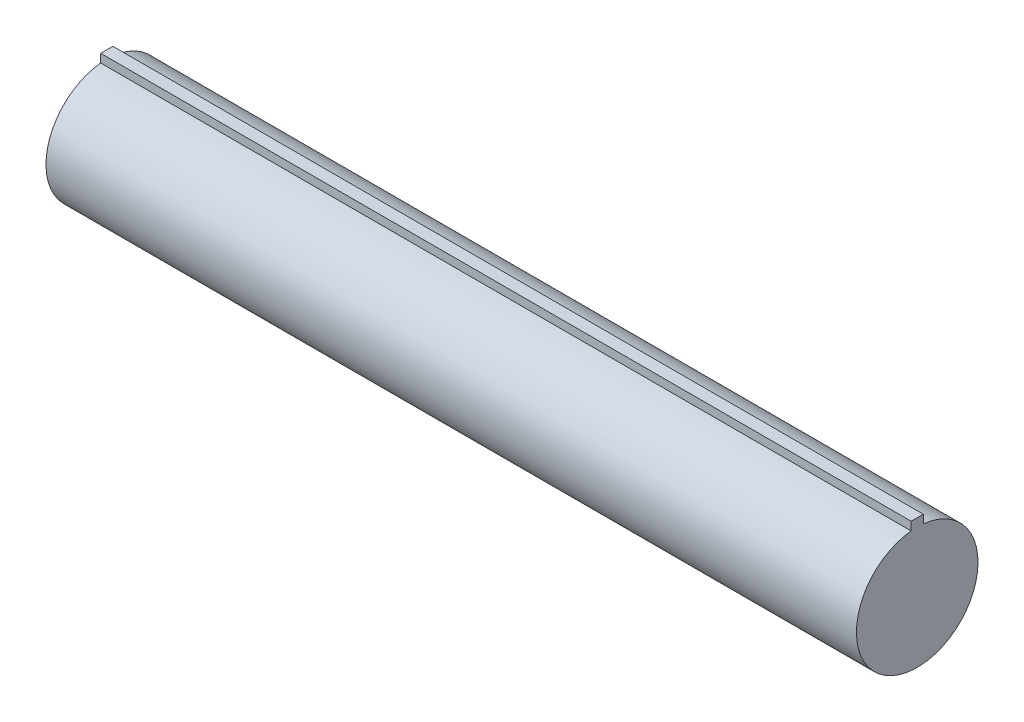
ISO-10303-21;
HEADER;
FILE_DESCRIPTION(('STEP AP214'),'2;1');
FILE_NAME('part.step','',(''),(''),'','','');
FILE_SCHEMA(('AUTOMOTIVE_DESIGN { 1 0 10303 214 1 1 1 1 }'));
ENDSEC;
DATA;
#1=APPLICATION_CONTEXT('core data for automotive mechanical design processes');
#2=APPLICATION_PROTOCOL_DEFINITION('international standard','automotive_design',2000,#1);
#3=PRODUCT_CONTEXT('',#1,'mechanical');
#4=PRODUCT('Part','Part','',(#3));
#5=PRODUCT_RELATED_PRODUCT_CATEGORY('part','',(#4));
#6=PRODUCT_DEFINITION_FORMATION('','',#4);
#7=PRODUCT_DEFINITION_CONTEXT('part definition',#1,'design');
#8=PRODUCT_DEFINITION('design','',#6,#7);
#9=PRODUCT_DEFINITION_SHAPE('','',#8);
#10=(LENGTH_UNIT() NAMED_UNIT(*) SI_UNIT(.MILLI.,.METRE.));
#11=(NAMED_UNIT(*) PLANE_ANGLE_UNIT() SI_UNIT($,.RADIAN.));
#12=(NAMED_UNIT(*) SI_UNIT($,.STERADIAN.) SOLID_ANGLE_UNIT());
#13=UNCERTAINTY_MEASURE_WITH_UNIT(LENGTH_MEASURE(1.E-05),#10,'distance_accuracy_value','');
#14=(GEOMETRIC_REPRESENTATION_CONTEXT(3) GLOBAL_UNCERTAINTY_ASSIGNED_CONTEXT((#13)) GLOBAL_UNIT_ASSIGNED_CONTEXT((#10,
#11,#12)) REPRESENTATION_CONTEXT('',''));
#15=CARTESIAN_POINT('',(0.,0.,0.));
#16=DIRECTION('',(0.,0.,1.));
#17=DIRECTION('',(1.,0.,0.));
#18=AXIS2_PLACEMENT_3D('',#15,#16,#17);
#19=CARTESIAN_POINT('',(100.,0.,0.));
#20=DIRECTION('',(-1.,0.,0.));
#21=DIRECTION('',(0.,0.,1.));
#22=AXIS2_PLACEMENT_3D('',#19,#20,#21);
#23=CYLINDRICAL_SURFACE('',#22,15.);
#24=CARTESIAN_POINT('',(-100.,0.,0.));
#25=DIRECTION('',(1.,0.,0.));
#26=DIRECTION('',(0.,0.,-1.));
#27=AXIS2_PLACEMENT_3D('',#24,#25,#26);
#28=CIRCLE('',#27,15.);
#29=CARTESIAN_POINT('',(-100.,14.9248115565993,1.5));
#30=VERTEX_POINT('',#29);
#31=CARTESIAN_POINT('',(-100.,14.9248115565993,-1.5));
#32=VERTEX_POINT('',#31);
#33=EDGE_CURVE('E104',#30,#32,#28,.T.);
#34=ORIENTED_EDGE('',*,*,#33,.T.);
#35=DIRECTION('',(-1.,0.,0.));
#36=VECTOR('',#35,1.);
#37=CARTESIAN_POINT('',(100.,14.9248115565993,-1.5));
#38=LINE('',#37,#36);
#39=CARTESIAN_POINT('',(100.,14.9248115565993,-1.5));
#40=VERTEX_POINT('',#39);
#41=EDGE_CURVE('E11',#40,#32,#38,.T.);
#42=ORIENTED_EDGE('',*,*,#41,.F.);
#43=CARTESIAN_POINT('',(100.,0.,0.));
#44=DIRECTION('',(1.,0.,0.));
#45=DIRECTION('',(0.,0.,-1.));
#46=AXIS2_PLACEMENT_3D('',#43,#44,#45);
#47=CIRCLE('',#46,15.);
#48=CARTESIAN_POINT('',(100.,14.9248115565993,1.5));
#49=VERTEX_POINT('',#48);
#50=EDGE_CURVE('E90',#49,#40,#47,.T.);
#51=ORIENTED_EDGE('',*,*,#50,.F.);
#52=DIRECTION('',(-1.,0.,0.));
#53=VECTOR('',#52,1.);
#54=CARTESIAN_POINT('',(100.,14.9248115565993,1.5));
#55=LINE('',#54,#53);
#56=EDGE_CURVE('E57',#49,#30,#55,.T.);
#57=ORIENTED_EDGE('',*,*,#56,.T.);
#58=EDGE_LOOP('',(#34,#42,#51,#57));
#59=FACE_BOUND('',#58,.T.);
#60=ADVANCED_FACE('F41',(#59),#23,.T.);
#61=CARTESIAN_POINT('',(100.,0.,-1.5));
#62=DIRECTION('',(0.,0.,1.));
#63=DIRECTION('',(0.,-1.,0.));
#64=AXIS2_PLACEMENT_3D('',#61,#62,#63);
#65=PLANE('',#64);
#66=DIRECTION('',(0.,1.,0.));
#67=VECTOR('',#66,1.);
#68=CARTESIAN_POINT('',(-100.,0.,-1.5));
#69=LINE('',#68,#67);
#70=CARTESIAN_POINT('',(-100.,17.,-1.5));
#71=VERTEX_POINT('',#70);
#72=EDGE_CURVE('E95',#32,#71,#69,.T.);
#73=ORIENTED_EDGE('',*,*,#72,.T.);
#74=DIRECTION('',(-1.,0.,0.));
#75=VECTOR('',#74,1.);
#76=CARTESIAN_POINT('',(100.,17.,-1.5));
#77=LINE('',#76,#75);
#78=CARTESIAN_POINT('',(100.,17.,-1.5));
#79=VERTEX_POINT('',#78);
#80=EDGE_CURVE('E49',#79,#71,#77,.T.);
#81=ORIENTED_EDGE('',*,*,#80,.F.);
#82=DIRECTION('',(0.,1.,0.));
#83=VECTOR('',#82,1.);
#84=CARTESIAN_POINT('',(100.,0.,-1.5));
#85=LINE('',#84,#83);
#86=EDGE_CURVE('E82',#40,#79,#85,.T.);
#87=ORIENTED_EDGE('',*,*,#86,.F.);
#88=ORIENTED_EDGE('',*,*,#41,.T.);
#89=EDGE_LOOP('',(#73,#81,#87,#88));
#90=FACE_BOUND('',#89,.T.);
#91=ADVANCED_FACE('F94',(#90),#65,.F.);
#92=CARTESIAN_POINT('',(100.,17.,0.));
#93=DIRECTION('',(0.,1.,0.));
#94=DIRECTION('',(0.,0.,1.));
#95=AXIS2_PLACEMENT_3D('',#92,#93,#94);
#96=PLANE('',#95);
#97=DIRECTION('',(0.,0.,-1.));
#98=VECTOR('',#97,1.);
#99=CARTESIAN_POINT('',(-100.,17.,0.));
#100=LINE('',#99,#98);
#101=CARTESIAN_POINT('',(-100.,17.,1.5));
#102=VERTEX_POINT('',#101);
#103=EDGE_CURVE('E107',#102,#71,#100,.T.);
#104=ORIENTED_EDGE('',*,*,#103,.F.);
#105=DIRECTION('',(-1.,0.,0.));
#106=VECTOR('',#105,1.);
#107=CARTESIAN_POINT('',(100.,17.,1.5));
#108=LINE('',#107,#106);
#109=CARTESIAN_POINT('',(100.,17.,1.5));
#110=VERTEX_POINT('',#109);
#111=EDGE_CURVE('E71',#110,#102,#108,.T.);
#112=ORIENTED_EDGE('',*,*,#111,.F.);
#113=DIRECTION('',(0.,0.,-1.));
#114=VECTOR('',#113,1.);
#115=CARTESIAN_POINT('',(100.,17.,0.));
#116=LINE('',#115,#114);
#117=EDGE_CURVE('E89',#110,#79,#116,.T.);
#118=ORIENTED_EDGE('',*,*,#117,.T.);
#119=ORIENTED_EDGE('',*,*,#80,.T.);
#120=EDGE_LOOP('',(#104,#112,#118,#119));
#121=FACE_BOUND('',#120,.T.);
#122=ADVANCED_FACE('F98',(#121),#96,.T.);
#123=CARTESIAN_POINT('',(100.,0.,1.5));
#124=DIRECTION('',(0.,0.,1.));
#125=DIRECTION('',(1.,0.,0.));
#126=AXIS2_PLACEMENT_3D('',#123,#124,#125);
#127=PLANE('',#126);
#128=DIRECTION('',(0.,1.,0.));
#129=VECTOR('',#128,1.);
#130=CARTESIAN_POINT('',(-100.,0.,1.5));
#131=LINE('',#130,#129);
#132=EDGE_CURVE('E109',#30,#102,#131,.T.);
#133=ORIENTED_EDGE('',*,*,#132,.F.);
#134=ORIENTED_EDGE('',*,*,#56,.F.);
#135=DIRECTION('',(0.,1.,0.));
#136=VECTOR('',#135,1.);
#137=CARTESIAN_POINT('',(100.,0.,1.5));
#138=LINE('',#137,#136);
#139=EDGE_CURVE('E99',#49,#110,#138,.T.);
#140=ORIENTED_EDGE('',*,*,#139,.T.);
#141=ORIENTED_EDGE('',*,*,#111,.T.);
#142=EDGE_LOOP('',(#133,#134,#140,#141));
#143=FACE_BOUND('',#142,.T.);
#144=ADVANCED_FACE('F115',(#143),#127,.T.);
#145=CARTESIAN_POINT('',(100.,0.,0.));
#146=DIRECTION('',(1.,0.,0.));
#147=DIRECTION('',(0.,0.,-1.));
#148=AXIS2_PLACEMENT_3D('',#145,#146,#147);
#149=PLANE('',#148);
#150=ORIENTED_EDGE('',*,*,#50,.T.);
#151=ORIENTED_EDGE('',*,*,#86,.T.);
#152=ORIENTED_EDGE('',*,*,#117,.F.);
#153=ORIENTED_EDGE('',*,*,#139,.F.);
#154=EDGE_LOOP('',(#150,#151,#152,#153));
#155=FACE_BOUND('',#154,.T.);
#156=ADVANCED_FACE('F86',(#155),#149,.T.);
#157=CARTESIAN_POINT('',(-100.,0.,0.));
#158=DIRECTION('',(1.,0.,0.));
#159=DIRECTION('',(0.,0.,-1.));
#160=AXIS2_PLACEMENT_3D('',#157,#158,#159);
#161=PLANE('',#160);
#162=ORIENTED_EDGE('',*,*,#33,.F.);
#163=ORIENTED_EDGE('',*,*,#132,.T.);
#164=ORIENTED_EDGE('',*,*,#103,.T.);
#165=ORIENTED_EDGE('',*,*,#72,.F.);
#166=EDGE_LOOP('',(#162,#163,#164,#165));
#167=FACE_BOUND('',#166,.T.);
#168=ADVANCED_FACE('F114',(#167),#161,.F.);
#169=CLOSED_SHELL('',(#60,#91,#122,#144,#156,#168));
#170=MANIFOLD_SOLID_BREP('B2',#169);
#171=ADVANCED_BREP_SHAPE_REPRESENTATION('',(#18,#170),#14);
#172=SHAPE_DEFINITION_REPRESENTATION(#9,#171);
ENDSEC;
END-ISO-10303-21;
